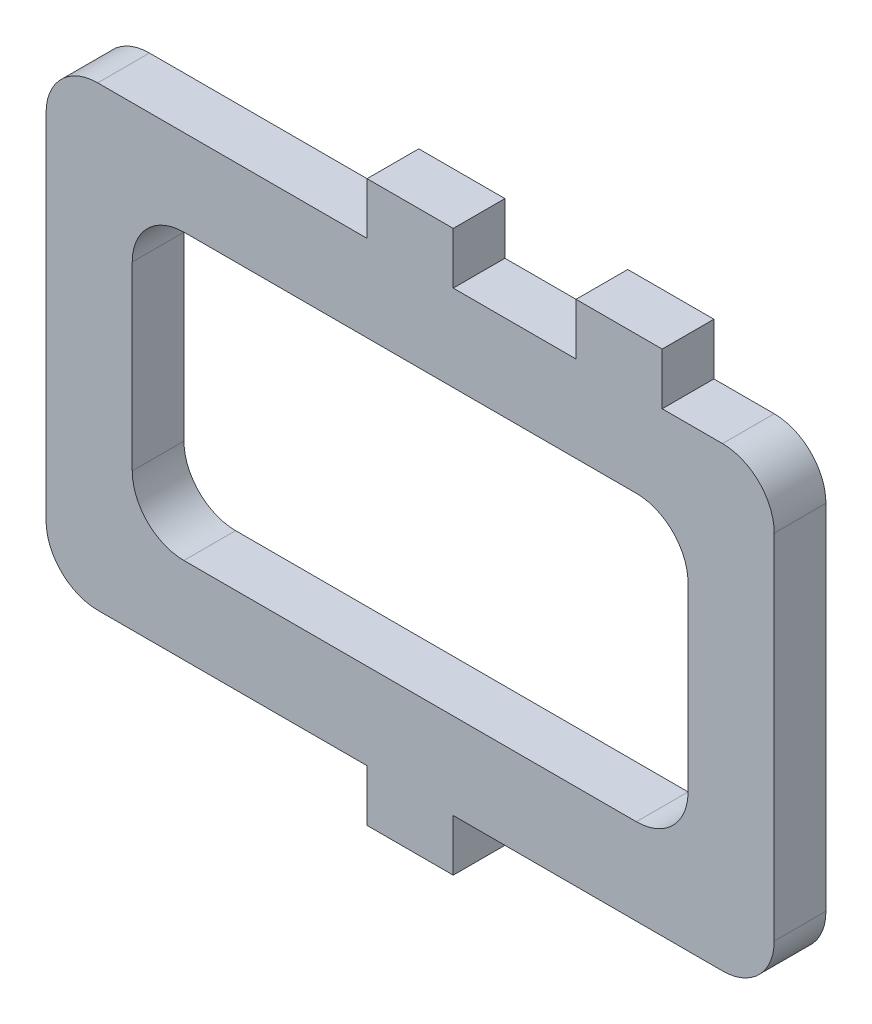
ISO-10303-21;
HEADER;
FILE_DESCRIPTION(('STEP AP214'),'2;1');
FILE_NAME('part.step','',(''),(''),'','','');
FILE_SCHEMA(('AUTOMOTIVE_DESIGN { 1 0 10303 214 1 1 1 1 }'));
ENDSEC;
DATA;
#1=APPLICATION_CONTEXT('core data for automotive mechanical design processes');
#2=APPLICATION_PROTOCOL_DEFINITION('international standard','automotive_design',2000,#1);
#3=PRODUCT_CONTEXT('',#1,'mechanical');
#4=PRODUCT('Part','Part','',(#3));
#5=PRODUCT_RELATED_PRODUCT_CATEGORY('part','',(#4));
#6=PRODUCT_DEFINITION_FORMATION('','',#4);
#7=PRODUCT_DEFINITION_CONTEXT('part definition',#1,'design');
#8=PRODUCT_DEFINITION('design','',#6,#7);
#9=PRODUCT_DEFINITION_SHAPE('','',#8);
#10=(LENGTH_UNIT() NAMED_UNIT(*) SI_UNIT(.MILLI.,.METRE.));
#11=(NAMED_UNIT(*) PLANE_ANGLE_UNIT() SI_UNIT($,.RADIAN.));
#12=(NAMED_UNIT(*) SI_UNIT($,.STERADIAN.) SOLID_ANGLE_UNIT());
#13=UNCERTAINTY_MEASURE_WITH_UNIT(LENGTH_MEASURE(1.E-05),#10,'distance_accuracy_value','');
#14=(GEOMETRIC_REPRESENTATION_CONTEXT(3) GLOBAL_UNCERTAINTY_ASSIGNED_CONTEXT((#13)) GLOBAL_UNIT_ASSIGNED_CONTEXT((#10,
#11,#12)) REPRESENTATION_CONTEXT('',''));
#15=CARTESIAN_POINT('',(0.,0.,0.));
#16=DIRECTION('',(0.,0.,1.));
#17=DIRECTION('',(1.,0.,0.));
#18=AXIS2_PLACEMENT_3D('',#15,#16,#17);
#19=CARTESIAN_POINT('',(-123.240102367902,-87.7219528240552,3.));
#20=DIRECTION('',(0.,0.,-1.));
#21=DIRECTION('',(-1.,0.,0.));
#22=AXIS2_PLACEMENT_3D('',#19,#20,#21);
#23=CYLINDRICAL_SURFACE('',#22,3.);
#24=CARTESIAN_POINT('',(-123.240102367902,-87.7219528240552,0.));
#25=DIRECTION('',(0.,0.,1.));
#26=DIRECTION('',(1.,0.,0.));
#27=AXIS2_PLACEMENT_3D('',#24,#25,#26);
#28=CIRCLE('',#27,3.);
#29=CARTESIAN_POINT('',(-126.240102367902,-87.7219528240552,0.));
#30=VERTEX_POINT('',#29);
#31=CARTESIAN_POINT('',(-123.240102367902,-90.7219528240552,0.));
#32=VERTEX_POINT('',#31);
#33=EDGE_CURVE('E258',#30,#32,#28,.T.);
#34=ORIENTED_EDGE('',*,*,#33,.T.);
#35=DIRECTION('',(0.,0.,-1.));
#36=VECTOR('',#35,1.);
#37=CARTESIAN_POINT('',(-123.240102367902,-90.7219528240552,3.));
#38=LINE('',#37,#36);
#39=CARTESIAN_POINT('',(-123.240102367902,-90.7219528240552,3.));
#40=VERTEX_POINT('',#39);
#41=EDGE_CURVE('E408',#40,#32,#38,.T.);
#42=ORIENTED_EDGE('',*,*,#41,.F.);
#43=CARTESIAN_POINT('',(-123.240102367902,-87.7219528240552,3.));
#44=DIRECTION('',(0.,0.,1.));
#45=DIRECTION('',(1.,0.,0.));
#46=AXIS2_PLACEMENT_3D('',#43,#44,#45);
#47=CIRCLE('',#46,3.);
#48=CARTESIAN_POINT('',(-126.240102367902,-87.7219528240552,3.));
#49=VERTEX_POINT('',#48);
#50=EDGE_CURVE('E269',#49,#40,#47,.T.);
#51=ORIENTED_EDGE('',*,*,#50,.F.);
#52=DIRECTION('',(0.,0.,-1.));
#53=VECTOR('',#52,1.);
#54=CARTESIAN_POINT('',(-126.240102367902,-87.7219528240552,3.));
#55=LINE('',#54,#53);
#56=EDGE_CURVE('E311',#49,#30,#55,.T.);
#57=ORIENTED_EDGE('',*,*,#56,.T.);
#58=EDGE_LOOP('',(#34,#42,#51,#57));
#59=FACE_BOUND('',#58,.T.);
#60=ADVANCED_FACE('F35',(#59),#23,.T.);
#61=CARTESIAN_POINT('',(-107.615102367902,-90.7219528240552,3.));
#62=DIRECTION('',(0.,1.,0.));
#63=DIRECTION('',(0.,0.,1.));
#64=AXIS2_PLACEMENT_3D('',#61,#62,#63);
#65=PLANE('',#64);
#66=DIRECTION('',(1.,0.,0.));
#67=VECTOR('',#66,1.);
#68=CARTESIAN_POINT('',(-107.615102367902,-90.7219528240552,0.));
#69=LINE('',#68,#67);
#70=CARTESIAN_POINT('',(-107.615102367902,-90.7219528240552,0.));
#71=VERTEX_POINT('',#70);
#72=EDGE_CURVE('E314',#32,#71,#69,.T.);
#73=ORIENTED_EDGE('',*,*,#72,.T.);
#74=DIRECTION('',(0.,0.,-1.));
#75=VECTOR('',#74,1.);
#76=CARTESIAN_POINT('',(-107.615102367902,-90.7219528240552,3.));
#77=LINE('',#76,#75);
#78=CARTESIAN_POINT('',(-107.615102367902,-90.7219528240552,3.));
#79=VERTEX_POINT('',#78);
#80=EDGE_CURVE('E405',#79,#71,#77,.T.);
#81=ORIENTED_EDGE('',*,*,#80,.F.);
#82=DIRECTION('',(1.,0.,0.));
#83=VECTOR('',#82,1.);
#84=CARTESIAN_POINT('',(-107.615102367902,-90.7219528240552,3.));
#85=LINE('',#84,#83);
#86=EDGE_CURVE('E272',#40,#79,#85,.T.);
#87=ORIENTED_EDGE('',*,*,#86,.F.);
#88=ORIENTED_EDGE('',*,*,#41,.T.);
#89=EDGE_LOOP('',(#73,#81,#87,#88));
#90=FACE_BOUND('',#89,.T.);
#91=ADVANCED_FACE('F459',(#90),#65,.F.);
#92=CARTESIAN_POINT('',(-107.615102367902,-90.7219528240552,3.));
#93=DIRECTION('',(1.,0.,0.));
#94=DIRECTION('',(0.,0.,-1.));
#95=AXIS2_PLACEMENT_3D('',#92,#93,#94);
#96=PLANE('',#95);
#97=DIRECTION('',(0.,-1.,0.));
#98=VECTOR('',#97,1.);
#99=CARTESIAN_POINT('',(-107.615102367902,-90.7219528240552,0.));
#100=LINE('',#99,#98);
#101=CARTESIAN_POINT('',(-107.615102367902,-93.7219528240552,0.));
#102=VERTEX_POINT('',#101);
#103=EDGE_CURVE('E316',#71,#102,#100,.T.);
#104=ORIENTED_EDGE('',*,*,#103,.T.);
#105=DIRECTION('',(0.,0.,-1.));
#106=VECTOR('',#105,1.);
#107=CARTESIAN_POINT('',(-107.615102367902,-93.7219528240552,3.));
#108=LINE('',#107,#106);
#109=CARTESIAN_POINT('',(-107.615102367902,-93.7219528240552,3.));
#110=VERTEX_POINT('',#109);
#111=EDGE_CURVE('E402',#110,#102,#108,.T.);
#112=ORIENTED_EDGE('',*,*,#111,.F.);
#113=DIRECTION('',(0.,-1.,0.));
#114=VECTOR('',#113,1.);
#115=CARTESIAN_POINT('',(-107.615102367902,-90.7219528240552,3.));
#116=LINE('',#115,#114);
#117=EDGE_CURVE('E275',#79,#110,#116,.T.);
#118=ORIENTED_EDGE('',*,*,#117,.F.);
#119=ORIENTED_EDGE('',*,*,#80,.T.);
#120=EDGE_LOOP('',(#104,#112,#118,#119));
#121=FACE_BOUND('',#120,.T.);
#122=ADVANCED_FACE('F464',(#121),#96,.F.);
#123=CARTESIAN_POINT('',(-107.615102367902,-93.7219528240552,3.));
#124=DIRECTION('',(0.,1.,0.));
#125=DIRECTION('',(0.,0.,1.));
#126=AXIS2_PLACEMENT_3D('',#123,#124,#125);
#127=PLANE('',#126);
#128=DIRECTION('',(1.,0.,0.));
#129=VECTOR('',#128,1.);
#130=CARTESIAN_POINT('',(-107.615102367902,-93.7219528240552,0.));
#131=LINE('',#130,#129);
#132=CARTESIAN_POINT('',(-102.615102367902,-93.7219528240552,0.));
#133=VERTEX_POINT('',#132);
#134=EDGE_CURVE('E318',#102,#133,#131,.T.);
#135=ORIENTED_EDGE('',*,*,#134,.T.);
#136=DIRECTION('',(0.,0.,-1.));
#137=VECTOR('',#136,1.);
#138=CARTESIAN_POINT('',(-102.615102367902,-93.7219528240552,3.));
#139=LINE('',#138,#137);
#140=CARTESIAN_POINT('',(-102.615102367902,-93.7219528240552,3.));
#141=VERTEX_POINT('',#140);
#142=EDGE_CURVE('E399',#141,#133,#139,.T.);
#143=ORIENTED_EDGE('',*,*,#142,.F.);
#144=DIRECTION('',(1.,0.,0.));
#145=VECTOR('',#144,1.);
#146=CARTESIAN_POINT('',(-107.615102367902,-93.7219528240552,3.));
#147=LINE('',#146,#145);
#148=EDGE_CURVE('E277',#110,#141,#147,.T.);
#149=ORIENTED_EDGE('',*,*,#148,.F.);
#150=ORIENTED_EDGE('',*,*,#111,.T.);
#151=EDGE_LOOP('',(#135,#143,#149,#150));
#152=FACE_BOUND('',#151,.T.);
#153=ADVANCED_FACE('F554',(#152),#127,.F.);
#154=CARTESIAN_POINT('',(-102.615102367902,-93.7219528240552,3.));
#155=DIRECTION('',(-1.,0.,0.));
#156=DIRECTION('',(0.,0.,1.));
#157=AXIS2_PLACEMENT_3D('',#154,#155,#156);
#158=PLANE('',#157);
#159=DIRECTION('',(0.,1.,0.));
#160=VECTOR('',#159,1.);
#161=CARTESIAN_POINT('',(-102.615102367902,-93.7219528240552,0.));
#162=LINE('',#161,#160);
#163=CARTESIAN_POINT('',(-102.615102367902,-90.7219528240552,0.));
#164=VERTEX_POINT('',#163);
#165=EDGE_CURVE('E320',#133,#164,#162,.T.);
#166=ORIENTED_EDGE('',*,*,#165,.T.);
#167=DIRECTION('',(0.,0.,-1.));
#168=VECTOR('',#167,1.);
#169=CARTESIAN_POINT('',(-102.615102367902,-90.7219528240552,3.));
#170=LINE('',#169,#168);
#171=CARTESIAN_POINT('',(-102.615102367902,-90.7219528240552,3.));
#172=VERTEX_POINT('',#171);
#173=EDGE_CURVE('E396',#172,#164,#170,.T.);
#174=ORIENTED_EDGE('',*,*,#173,.F.);
#175=DIRECTION('',(0.,1.,0.));
#176=VECTOR('',#175,1.);
#177=CARTESIAN_POINT('',(-102.615102367902,-93.7219528240552,3.));
#178=LINE('',#177,#176);
#179=EDGE_CURVE('E279',#141,#172,#178,.T.);
#180=ORIENTED_EDGE('',*,*,#179,.F.);
#181=ORIENTED_EDGE('',*,*,#142,.T.);
#182=EDGE_LOOP('',(#166,#174,#180,#181));
#183=FACE_BOUND('',#182,.T.);
#184=ADVANCED_FACE('F551',(#183),#158,.F.);
#185=CARTESIAN_POINT('',(-102.615102367902,-90.7219528240552,3.));
#186=DIRECTION('',(0.,1.,0.));
#187=DIRECTION('',(0.,0.,1.));
#188=AXIS2_PLACEMENT_3D('',#185,#186,#187);
#189=PLANE('',#188);
#190=DIRECTION('',(1.,0.,0.));
#191=VECTOR('',#190,1.);
#192=CARTESIAN_POINT('',(-102.615102367902,-90.7219528240552,0.));
#193=LINE('',#192,#191);
#194=CARTESIAN_POINT('',(-86.9901023679022,-90.7219528240552,0.));
#195=VERTEX_POINT('',#194);
#196=EDGE_CURVE('E322',#164,#195,#193,.T.);
#197=ORIENTED_EDGE('',*,*,#196,.T.);
#198=DIRECTION('',(0.,0.,-1.));
#199=VECTOR('',#198,1.);
#200=CARTESIAN_POINT('',(-86.9901023679022,-90.7219528240552,3.));
#201=LINE('',#200,#199);
#202=CARTESIAN_POINT('',(-86.9901023679022,-90.7219528240552,3.));
#203=VERTEX_POINT('',#202);
#204=EDGE_CURVE('E393',#203,#195,#201,.T.);
#205=ORIENTED_EDGE('',*,*,#204,.F.);
#206=DIRECTION('',(1.,0.,0.));
#207=VECTOR('',#206,1.);
#208=CARTESIAN_POINT('',(-102.615102367902,-90.7219528240552,3.));
#209=LINE('',#208,#207);
#210=EDGE_CURVE('E281',#172,#203,#209,.T.);
#211=ORIENTED_EDGE('',*,*,#210,.F.);
#212=ORIENTED_EDGE('',*,*,#173,.T.);
#213=EDGE_LOOP('',(#197,#205,#211,#212));
#214=FACE_BOUND('',#213,.T.);
#215=ADVANCED_FACE('F547',(#214),#189,.F.);
#216=CARTESIAN_POINT('',(-86.9901023679022,-87.7219528240552,3.));
#217=DIRECTION('',(0.,0.,-1.));
#218=DIRECTION('',(-1.,0.,0.));
#219=AXIS2_PLACEMENT_3D('',#216,#217,#218);
#220=CYLINDRICAL_SURFACE('',#219,3.);
#221=CARTESIAN_POINT('',(-86.9901023679022,-87.7219528240552,0.));
#222=DIRECTION('',(0.,0.,1.));
#223=DIRECTION('',(1.,0.,0.));
#224=AXIS2_PLACEMENT_3D('',#221,#222,#223);
#225=CIRCLE('',#224,3.);
#226=CARTESIAN_POINT('',(-83.9901023679022,-87.7219528240552,0.));
#227=VERTEX_POINT('',#226);
#228=EDGE_CURVE('E324',#195,#227,#225,.T.);
#229=ORIENTED_EDGE('',*,*,#228,.T.);
#230=DIRECTION('',(0.,0.,-1.));
#231=VECTOR('',#230,1.);
#232=CARTESIAN_POINT('',(-83.9901023679022,-87.7219528240552,3.));
#233=LINE('',#232,#231);
#234=CARTESIAN_POINT('',(-83.9901023679022,-87.7219528240552,3.));
#235=VERTEX_POINT('',#234);
#236=EDGE_CURVE('E390',#235,#227,#233,.T.);
#237=ORIENTED_EDGE('',*,*,#236,.F.);
#238=CARTESIAN_POINT('',(-86.9901023679022,-87.7219528240552,3.));
#239=DIRECTION('',(0.,0.,1.));
#240=DIRECTION('',(1.,0.,0.));
#241=AXIS2_PLACEMENT_3D('',#238,#239,#240);
#242=CIRCLE('',#241,3.);
#243=EDGE_CURVE('E283',#203,#235,#242,.T.);
#244=ORIENTED_EDGE('',*,*,#243,.F.);
#245=ORIENTED_EDGE('',*,*,#204,.T.);
#246=EDGE_LOOP('',(#229,#237,#244,#245));
#247=FACE_BOUND('',#246,.T.);
#248=ADVANCED_FACE('F542',(#247),#220,.T.);
#249=CARTESIAN_POINT('',(-83.9901023679022,-87.7219528240552,3.));
#250=DIRECTION('',(-1.,0.,0.));
#251=DIRECTION('',(0.,-1.,0.));
#252=AXIS2_PLACEMENT_3D('',#249,#250,#251);
#253=PLANE('',#252);
#254=DIRECTION('',(0.,1.,0.));
#255=VECTOR('',#254,1.);
#256=CARTESIAN_POINT('',(-83.9901023679022,-87.7219528240552,0.));
#257=LINE('',#256,#255);
#258=CARTESIAN_POINT('',(-83.9901023679022,-67.2219528240552,0.));
#259=VERTEX_POINT('',#258);
#260=EDGE_CURVE('E326',#227,#259,#257,.T.);
#261=ORIENTED_EDGE('',*,*,#260,.T.);
#262=DIRECTION('',(0.,0.,-1.));
#263=VECTOR('',#262,1.);
#264=CARTESIAN_POINT('',(-83.9901023679022,-67.2219528240552,3.));
#265=LINE('',#264,#263);
#266=CARTESIAN_POINT('',(-83.9901023679022,-67.2219528240552,3.));
#267=VERTEX_POINT('',#266);
#268=EDGE_CURVE('E387',#267,#259,#265,.T.);
#269=ORIENTED_EDGE('',*,*,#268,.F.);
#270=DIRECTION('',(0.,1.,0.));
#271=VECTOR('',#270,1.);
#272=CARTESIAN_POINT('',(-83.9901023679022,-87.7219528240552,3.));
#273=LINE('',#272,#271);
#274=EDGE_CURVE('E285',#235,#267,#273,.T.);
#275=ORIENTED_EDGE('',*,*,#274,.F.);
#276=ORIENTED_EDGE('',*,*,#236,.T.);
#277=EDGE_LOOP('',(#261,#269,#275,#276));
#278=FACE_BOUND('',#277,.T.);
#279=ADVANCED_FACE('F536',(#278),#253,.F.);
#280=CARTESIAN_POINT('',(-86.9901023679022,-67.2219528240552,3.));
#281=DIRECTION('',(0.,0.,-1.));
#282=DIRECTION('',(-1.,0.,0.));
#283=AXIS2_PLACEMENT_3D('',#280,#281,#282);
#284=CYLINDRICAL_SURFACE('',#283,3.);
#285=CARTESIAN_POINT('',(-86.9901023679022,-67.2219528240552,0.));
#286=DIRECTION('',(0.,0.,1.));
#287=DIRECTION('',(1.,0.,0.));
#288=AXIS2_PLACEMENT_3D('',#285,#286,#287);
#289=CIRCLE('',#288,3.);
#290=CARTESIAN_POINT('',(-86.9901023679022,-64.2219528240552,0.));
#291=VERTEX_POINT('',#290);
#292=EDGE_CURVE('E328',#259,#291,#289,.T.);
#293=ORIENTED_EDGE('',*,*,#292,.T.);
#294=DIRECTION('',(0.,0.,-1.));
#295=VECTOR('',#294,1.);
#296=CARTESIAN_POINT('',(-86.9901023679022,-64.2219528240552,3.));
#297=LINE('',#296,#295);
#298=CARTESIAN_POINT('',(-86.9901023679022,-64.2219528240552,3.));
#299=VERTEX_POINT('',#298);
#300=EDGE_CURVE('E384',#299,#291,#297,.T.);
#301=ORIENTED_EDGE('',*,*,#300,.F.);
#302=CARTESIAN_POINT('',(-86.9901023679022,-67.2219528240552,3.));
#303=DIRECTION('',(0.,0.,1.));
#304=DIRECTION('',(1.,0.,0.));
#305=AXIS2_PLACEMENT_3D('',#302,#303,#304);
#306=CIRCLE('',#305,3.);
#307=EDGE_CURVE('E287',#267,#299,#306,.T.);
#308=ORIENTED_EDGE('',*,*,#307,.F.);
#309=ORIENTED_EDGE('',*,*,#268,.T.);
#310=EDGE_LOOP('',(#293,#301,#308,#309));
#311=FACE_BOUND('',#310,.T.);
#312=ADVANCED_FACE('F532',(#311),#284,.T.);
#313=CARTESIAN_POINT('',(-90.4901023679022,-64.2219528240552,3.));
#314=DIRECTION('',(0.,-1.,0.));
#315=DIRECTION('',(0.,0.,-1.));
#316=AXIS2_PLACEMENT_3D('',#313,#314,#315);
#317=PLANE('',#316);
#318=DIRECTION('',(-1.,0.,0.));
#319=VECTOR('',#318,1.);
#320=CARTESIAN_POINT('',(-90.4901023679022,-64.2219528240552,0.));
#321=LINE('',#320,#319);
#322=CARTESIAN_POINT('',(-90.4901023679022,-64.2219528240552,0.));
#323=VERTEX_POINT('',#322);
#324=EDGE_CURVE('E330',#291,#323,#321,.T.);
#325=ORIENTED_EDGE('',*,*,#324,.T.);
#326=DIRECTION('',(0.,0.,-1.));
#327=VECTOR('',#326,1.);
#328=CARTESIAN_POINT('',(-90.4901023679022,-64.2219528240552,3.));
#329=LINE('',#328,#327);
#330=CARTESIAN_POINT('',(-90.4901023679022,-64.2219528240552,3.));
#331=VERTEX_POINT('',#330);
#332=EDGE_CURVE('E381',#331,#323,#329,.T.);
#333=ORIENTED_EDGE('',*,*,#332,.F.);
#334=DIRECTION('',(-1.,0.,0.));
#335=VECTOR('',#334,1.);
#336=CARTESIAN_POINT('',(-90.4901023679022,-64.2219528240552,3.));
#337=LINE('',#336,#335);
#338=EDGE_CURVE('E289',#299,#331,#337,.T.);
#339=ORIENTED_EDGE('',*,*,#338,.F.);
#340=ORIENTED_EDGE('',*,*,#300,.T.);
#341=EDGE_LOOP('',(#325,#333,#339,#340));
#342=FACE_BOUND('',#341,.T.);
#343=ADVANCED_FACE('F527',(#342),#317,.F.);
#344=CARTESIAN_POINT('',(-90.4901023679022,-61.2219528240552,3.));
#345=DIRECTION('',(-1.,0.,0.));
#346=DIRECTION('',(0.,0.,1.));
#347=AXIS2_PLACEMENT_3D('',#344,#345,#346);
#348=PLANE('',#347);
#349=DIRECTION('',(0.,1.,0.));
#350=VECTOR('',#349,1.);
#351=CARTESIAN_POINT('',(-90.4901023679022,-61.2219528240552,0.));
#352=LINE('',#351,#350);
#353=CARTESIAN_POINT('',(-90.4901023679022,-61.2219528240552,0.));
#354=VERTEX_POINT('',#353);
#355=EDGE_CURVE('E332',#323,#354,#352,.T.);
#356=ORIENTED_EDGE('',*,*,#355,.T.);
#357=DIRECTION('',(0.,0.,-1.));
#358=VECTOR('',#357,1.);
#359=CARTESIAN_POINT('',(-90.4901023679022,-61.2219528240552,3.));
#360=LINE('',#359,#358);
#361=CARTESIAN_POINT('',(-90.4901023679022,-61.2219528240552,3.));
#362=VERTEX_POINT('',#361);
#363=EDGE_CURVE('E378',#362,#354,#360,.T.);
#364=ORIENTED_EDGE('',*,*,#363,.F.);
#365=DIRECTION('',(0.,1.,0.));
#366=VECTOR('',#365,1.);
#367=CARTESIAN_POINT('',(-90.4901023679022,-61.2219528240552,3.));
#368=LINE('',#367,#366);
#369=EDGE_CURVE('E291',#331,#362,#368,.T.);
#370=ORIENTED_EDGE('',*,*,#369,.F.);
#371=ORIENTED_EDGE('',*,*,#332,.T.);
#372=EDGE_LOOP('',(#356,#364,#370,#371));
#373=FACE_BOUND('',#372,.T.);
#374=ADVANCED_FACE('F521',(#373),#348,.F.);
#375=CARTESIAN_POINT('',(-95.4901023679022,-61.2219528240552,3.));
#376=DIRECTION('',(0.,-1.,0.));
#377=DIRECTION('',(0.,0.,-1.));
#378=AXIS2_PLACEMENT_3D('',#375,#376,#377);
#379=PLANE('',#378);
#380=DIRECTION('',(-1.,0.,0.));
#381=VECTOR('',#380,1.);
#382=CARTESIAN_POINT('',(-95.4901023679022,-61.2219528240552,0.));
#383=LINE('',#382,#381);
#384=CARTESIAN_POINT('',(-95.4901023679022,-61.2219528240552,0.));
#385=VERTEX_POINT('',#384);
#386=EDGE_CURVE('E334',#354,#385,#383,.T.);
#387=ORIENTED_EDGE('',*,*,#386,.T.);
#388=DIRECTION('',(0.,0.,-1.));
#389=VECTOR('',#388,1.);
#390=CARTESIAN_POINT('',(-95.4901023679022,-61.2219528240552,3.));
#391=LINE('',#390,#389);
#392=CARTESIAN_POINT('',(-95.4901023679022,-61.2219528240552,3.));
#393=VERTEX_POINT('',#392);
#394=EDGE_CURVE('E375',#393,#385,#391,.T.);
#395=ORIENTED_EDGE('',*,*,#394,.F.);
#396=DIRECTION('',(-1.,0.,0.));
#397=VECTOR('',#396,1.);
#398=CARTESIAN_POINT('',(-95.4901023679022,-61.2219528240552,3.));
#399=LINE('',#398,#397);
#400=EDGE_CURVE('E293',#362,#393,#399,.T.);
#401=ORIENTED_EDGE('',*,*,#400,.F.);
#402=ORIENTED_EDGE('',*,*,#363,.T.);
#403=EDGE_LOOP('',(#387,#395,#401,#402));
#404=FACE_BOUND('',#403,.T.);
#405=ADVANCED_FACE('F517',(#404),#379,.F.);
#406=CARTESIAN_POINT('',(-95.4901023679022,-61.2219528240552,3.));
#407=DIRECTION('',(1.,0.,0.));
#408=DIRECTION('',(0.,0.,-1.));
#409=AXIS2_PLACEMENT_3D('',#406,#407,#408);
#410=PLANE('',#409);
#411=DIRECTION('',(0.,-1.,0.));
#412=VECTOR('',#411,1.);
#413=CARTESIAN_POINT('',(-95.4901023679022,-61.2219528240552,0.));
#414=LINE('',#413,#412);
#415=CARTESIAN_POINT('',(-95.4901023679022,-64.2219528240552,0.));
#416=VERTEX_POINT('',#415);
#417=EDGE_CURVE('E336',#385,#416,#414,.T.);
#418=ORIENTED_EDGE('',*,*,#417,.T.);
#419=DIRECTION('',(0.,0.,-1.));
#420=VECTOR('',#419,1.);
#421=CARTESIAN_POINT('',(-95.4901023679022,-64.2219528240552,3.));
#422=LINE('',#421,#420);
#423=CARTESIAN_POINT('',(-95.4901023679022,-64.2219528240552,3.));
#424=VERTEX_POINT('',#423);
#425=EDGE_CURVE('E372',#424,#416,#422,.T.);
#426=ORIENTED_EDGE('',*,*,#425,.F.);
#427=DIRECTION('',(0.,-1.,0.));
#428=VECTOR('',#427,1.);
#429=CARTESIAN_POINT('',(-95.4901023679022,-61.2219528240552,3.));
#430=LINE('',#429,#428);
#431=EDGE_CURVE('E295',#393,#424,#430,.T.);
#432=ORIENTED_EDGE('',*,*,#431,.F.);
#433=ORIENTED_EDGE('',*,*,#394,.T.);
#434=EDGE_LOOP('',(#418,#426,#432,#433));
#435=FACE_BOUND('',#434,.T.);
#436=ADVANCED_FACE('F512',(#435),#410,.F.);
#437=CARTESIAN_POINT('',(-95.4901023679022,-64.2219528240552,3.));
#438=DIRECTION('',(0.,-1.,0.));
#439=DIRECTION('',(0.,0.,-1.));
#440=AXIS2_PLACEMENT_3D('',#437,#438,#439);
#441=PLANE('',#440);
#442=DIRECTION('',(-1.,0.,0.));
#443=VECTOR('',#442,1.);
#444=CARTESIAN_POINT('',(-95.4901023679022,-64.2219528240552,0.));
#445=LINE('',#444,#443);
#446=CARTESIAN_POINT('',(-102.615102367902,-64.2219528240552,0.));
#447=VERTEX_POINT('',#446);
#448=EDGE_CURVE('E338',#416,#447,#445,.T.);
#449=ORIENTED_EDGE('',*,*,#448,.T.);
#450=DIRECTION('',(0.,0.,-1.));
#451=VECTOR('',#450,1.);
#452=CARTESIAN_POINT('',(-102.615102367902,-64.2219528240552,3.));
#453=LINE('',#452,#451);
#454=CARTESIAN_POINT('',(-102.615102367902,-64.2219528240552,3.));
#455=VERTEX_POINT('',#454);
#456=EDGE_CURVE('E369',#455,#447,#453,.T.);
#457=ORIENTED_EDGE('',*,*,#456,.F.);
#458=DIRECTION('',(-1.,0.,0.));
#459=VECTOR('',#458,1.);
#460=CARTESIAN_POINT('',(-95.4901023679022,-64.2219528240552,3.));
#461=LINE('',#460,#459);
#462=EDGE_CURVE('E297',#424,#455,#461,.T.);
#463=ORIENTED_EDGE('',*,*,#462,.F.);
#464=ORIENTED_EDGE('',*,*,#425,.T.);
#465=EDGE_LOOP('',(#449,#457,#463,#464));
#466=FACE_BOUND('',#465,.T.);
#467=ADVANCED_FACE('F506',(#466),#441,.F.);
#468=CARTESIAN_POINT('',(-102.615102367902,-61.2219528240552,3.));
#469=DIRECTION('',(-1.,0.,0.));
#470=DIRECTION('',(0.,0.,1.));
#471=AXIS2_PLACEMENT_3D('',#468,#469,#470);
#472=PLANE('',#471);
#473=DIRECTION('',(0.,1.,0.));
#474=VECTOR('',#473,1.);
#475=CARTESIAN_POINT('',(-102.615102367902,-61.2219528240552,0.));
#476=LINE('',#475,#474);
#477=CARTESIAN_POINT('',(-102.615102367902,-61.2219528240552,0.));
#478=VERTEX_POINT('',#477);
#479=EDGE_CURVE('E340',#447,#478,#476,.T.);
#480=ORIENTED_EDGE('',*,*,#479,.T.);
#481=DIRECTION('',(0.,0.,-1.));
#482=VECTOR('',#481,1.);
#483=CARTESIAN_POINT('',(-102.615102367902,-61.2219528240552,3.));
#484=LINE('',#483,#482);
#485=CARTESIAN_POINT('',(-102.615102367902,-61.2219528240552,3.));
#486=VERTEX_POINT('',#485);
#487=EDGE_CURVE('E366',#486,#478,#484,.T.);
#488=ORIENTED_EDGE('',*,*,#487,.F.);
#489=DIRECTION('',(0.,1.,0.));
#490=VECTOR('',#489,1.);
#491=CARTESIAN_POINT('',(-102.615102367902,-61.2219528240552,3.));
#492=LINE('',#491,#490);
#493=EDGE_CURVE('E299',#455,#486,#492,.T.);
#494=ORIENTED_EDGE('',*,*,#493,.F.);
#495=ORIENTED_EDGE('',*,*,#456,.T.);
#496=EDGE_LOOP('',(#480,#488,#494,#495));
#497=FACE_BOUND('',#496,.T.);
#498=ADVANCED_FACE('F501',(#497),#472,.F.);
#499=CARTESIAN_POINT('',(-107.615102367902,-61.2219528240552,3.));
#500=DIRECTION('',(0.,-1.,0.));
#501=DIRECTION('',(0.,0.,-1.));
#502=AXIS2_PLACEMENT_3D('',#499,#500,#501);
#503=PLANE('',#502);
#504=DIRECTION('',(-1.,0.,0.));
#505=VECTOR('',#504,1.);
#506=CARTESIAN_POINT('',(-107.615102367902,-61.2219528240552,0.));
#507=LINE('',#506,#505);
#508=CARTESIAN_POINT('',(-107.615102367902,-61.2219528240552,0.));
#509=VERTEX_POINT('',#508);
#510=EDGE_CURVE('E343',#478,#509,#507,.T.);
#511=ORIENTED_EDGE('',*,*,#510,.T.);
#512=DIRECTION('',(0.,0.,-1.));
#513=VECTOR('',#512,1.);
#514=CARTESIAN_POINT('',(-107.615102367902,-61.2219528240552,3.));
#515=LINE('',#514,#513);
#516=CARTESIAN_POINT('',(-107.615102367902,-61.2219528240552,3.));
#517=VERTEX_POINT('',#516);
#518=EDGE_CURVE('E363',#517,#509,#515,.T.);
#519=ORIENTED_EDGE('',*,*,#518,.F.);
#520=DIRECTION('',(-1.,0.,0.));
#521=VECTOR('',#520,1.);
#522=CARTESIAN_POINT('',(-105.115102367902,-61.2219528240552,3.));
#523=LINE('',#522,#521);
#524=EDGE_CURVE('E301',#486,#517,#523,.T.);
#525=ORIENTED_EDGE('',*,*,#524,.F.);
#526=ORIENTED_EDGE('',*,*,#487,.T.);
#527=EDGE_LOOP('',(#511,#519,#525,#526));
#528=FACE_BOUND('',#527,.T.);
#529=ADVANCED_FACE('F496',(#528),#503,.F.);
#530=CARTESIAN_POINT('',(-107.615102367902,-61.2219528240552,3.));
#531=DIRECTION('',(1.,0.,0.));
#532=DIRECTION('',(0.,0.,-1.));
#533=AXIS2_PLACEMENT_3D('',#530,#531,#532);
#534=PLANE('',#533);
#535=DIRECTION('',(0.,-1.,0.));
#536=VECTOR('',#535,1.);
#537=CARTESIAN_POINT('',(-107.615102367902,-61.2219528240552,0.));
#538=LINE('',#537,#536);
#539=CARTESIAN_POINT('',(-107.615102367902,-64.2219528240552,0.));
#540=VERTEX_POINT('',#539);
#541=EDGE_CURVE('E345',#509,#540,#538,.T.);
#542=ORIENTED_EDGE('',*,*,#541,.T.);
#543=DIRECTION('',(0.,0.,-1.));
#544=VECTOR('',#543,1.);
#545=CARTESIAN_POINT('',(-107.615102367902,-64.2219528240552,3.));
#546=LINE('',#545,#544);
#547=CARTESIAN_POINT('',(-107.615102367902,-64.2219528240552,3.));
#548=VERTEX_POINT('',#547);
#549=EDGE_CURVE('E360',#548,#540,#546,.T.);
#550=ORIENTED_EDGE('',*,*,#549,.F.);
#551=DIRECTION('',(0.,-1.,0.));
#552=VECTOR('',#551,1.);
#553=CARTESIAN_POINT('',(-107.615102367902,-61.2219528240552,3.));
#554=LINE('',#553,#552);
#555=EDGE_CURVE('E303',#517,#548,#554,.T.);
#556=ORIENTED_EDGE('',*,*,#555,.F.);
#557=ORIENTED_EDGE('',*,*,#518,.T.);
#558=EDGE_LOOP('',(#542,#550,#556,#557));
#559=FACE_BOUND('',#558,.T.);
#560=ADVANCED_FACE('F492',(#559),#534,.F.);
#561=CARTESIAN_POINT('',(-123.240102367902,-64.2219528240552,3.));
#562=DIRECTION('',(0.,-1.,0.));
#563=DIRECTION('',(0.,0.,-1.));
#564=AXIS2_PLACEMENT_3D('',#561,#562,#563);
#565=PLANE('',#564);
#566=DIRECTION('',(-1.,0.,0.));
#567=VECTOR('',#566,1.);
#568=CARTESIAN_POINT('',(-123.240102367902,-64.2219528240552,0.));
#569=LINE('',#568,#567);
#570=CARTESIAN_POINT('',(-123.240102367902,-64.2219528240552,0.));
#571=VERTEX_POINT('',#570);
#572=EDGE_CURVE('E347',#540,#571,#569,.T.);
#573=ORIENTED_EDGE('',*,*,#572,.T.);
#574=DIRECTION('',(0.,0.,-1.));
#575=VECTOR('',#574,1.);
#576=CARTESIAN_POINT('',(-123.240102367902,-64.2219528240552,3.));
#577=LINE('',#576,#575);
#578=CARTESIAN_POINT('',(-123.240102367902,-64.2219528240552,3.));
#579=VERTEX_POINT('',#578);
#580=EDGE_CURVE('E357',#579,#571,#577,.T.);
#581=ORIENTED_EDGE('',*,*,#580,.F.);
#582=DIRECTION('',(-1.,0.,0.));
#583=VECTOR('',#582,1.);
#584=CARTESIAN_POINT('',(-123.240102367902,-64.2219528240552,3.));
#585=LINE('',#584,#583);
#586=EDGE_CURVE('E305',#548,#579,#585,.T.);
#587=ORIENTED_EDGE('',*,*,#586,.F.);
#588=ORIENTED_EDGE('',*,*,#549,.T.);
#589=EDGE_LOOP('',(#573,#581,#587,#588));
#590=FACE_BOUND('',#589,.T.);
#591=ADVANCED_FACE('F487',(#590),#565,.F.);
#592=CARTESIAN_POINT('',(-123.240102367902,-67.2219528240552,3.));
#593=DIRECTION('',(0.,0.,-1.));
#594=DIRECTION('',(-1.,0.,0.));
#595=AXIS2_PLACEMENT_3D('',#592,#593,#594);
#596=CYLINDRICAL_SURFACE('',#595,3.);
#597=CARTESIAN_POINT('',(-123.240102367902,-67.2219528240552,0.));
#598=DIRECTION('',(0.,0.,1.));
#599=DIRECTION('',(-1.,0.,0.));
#600=AXIS2_PLACEMENT_3D('',#597,#598,#599);
#601=CIRCLE('',#600,3.);
#602=CARTESIAN_POINT('',(-126.240102367902,-67.2219528240552,0.));
#603=VERTEX_POINT('',#602);
#604=EDGE_CURVE('E349',#571,#603,#601,.T.);
#605=ORIENTED_EDGE('',*,*,#604,.T.);
#606=DIRECTION('',(0.,0.,-1.));
#607=VECTOR('',#606,1.);
#608=CARTESIAN_POINT('',(-126.240102367902,-67.2219528240552,3.));
#609=LINE('',#608,#607);
#610=CARTESIAN_POINT('',(-126.240102367902,-67.2219528240552,3.));
#611=VERTEX_POINT('',#610);
#612=EDGE_CURVE('E354',#611,#603,#609,.T.);
#613=ORIENTED_EDGE('',*,*,#612,.F.);
#614=CARTESIAN_POINT('',(-123.240102367902,-67.2219528240552,3.));
#615=DIRECTION('',(0.,0.,1.));
#616=DIRECTION('',(-1.,0.,0.));
#617=AXIS2_PLACEMENT_3D('',#614,#615,#616);
#618=CIRCLE('',#617,3.);
#619=EDGE_CURVE('E307',#579,#611,#618,.T.);
#620=ORIENTED_EDGE('',*,*,#619,.F.);
#621=ORIENTED_EDGE('',*,*,#580,.T.);
#622=EDGE_LOOP('',(#605,#613,#620,#621));
#623=FACE_BOUND('',#622,.T.);
#624=ADVANCED_FACE('F482',(#623),#596,.T.);
#625=CARTESIAN_POINT('',(-126.240102367902,-87.7219528240552,3.));
#626=DIRECTION('',(1.,0.,0.));
#627=DIRECTION('',(0.,0.,-1.));
#628=AXIS2_PLACEMENT_3D('',#625,#626,#627);
#629=PLANE('',#628);
#630=DIRECTION('',(0.,-1.,0.));
#631=VECTOR('',#630,1.);
#632=CARTESIAN_POINT('',(-126.240102367902,-87.7219528240552,0.));
#633=LINE('',#632,#631);
#634=EDGE_CURVE('E273',#603,#30,#633,.T.);
#635=ORIENTED_EDGE('',*,*,#634,.T.);
#636=ORIENTED_EDGE('',*,*,#56,.F.);
#637=DIRECTION('',(0.,-1.,0.));
#638=VECTOR('',#637,1.);
#639=CARTESIAN_POINT('',(-126.240102367902,-87.7219528240552,3.));
#640=LINE('',#639,#638);
#641=EDGE_CURVE('E309',#611,#49,#640,.T.);
#642=ORIENTED_EDGE('',*,*,#641,.F.);
#643=ORIENTED_EDGE('',*,*,#612,.T.);
#644=EDGE_LOOP('',(#635,#636,#642,#643));
#645=FACE_BOUND('',#644,.T.);
#646=ADVANCED_FACE('F480',(#645),#629,.F.);
#647=CARTESIAN_POINT('',(-123.240102367902,-87.7219528240552,3.));
#648=DIRECTION('',(0.,0.,1.));
#649=DIRECTION('',(1.,0.,0.));
#650=AXIS2_PLACEMENT_3D('',#647,#648,#649);
#651=PLANE('',#650);
#652=CARTESIAN_POINT('',(-118.240102367902,-82.7219528240552,3.));
#653=DIRECTION('',(0.,0.,1.));
#654=DIRECTION('',(-1.,0.,0.));
#655=AXIS2_PLACEMENT_3D('',#652,#653,#654);
#656=CIRCLE('',#655,3.);
#657=CARTESIAN_POINT('',(-121.240102367902,-82.7219528240552,3.));
#658=VERTEX_POINT('',#657);
#659=CARTESIAN_POINT('',(-118.240102367902,-85.7219528240552,3.));
#660=VERTEX_POINT('',#659);
#661=EDGE_CURVE('E49',#658,#660,#656,.T.);
#662=ORIENTED_EDGE('',*,*,#661,.F.);
#663=DIRECTION('',(0.,-1.,0.));
#664=VECTOR('',#663,1.);
#665=CARTESIAN_POINT('',(-121.240102367902,-82.7219528240552,3.));
#666=LINE('',#665,#664);
#667=CARTESIAN_POINT('',(-121.240102367902,-72.2219528240552,3.));
#668=VERTEX_POINT('',#667);
#669=EDGE_CURVE('E253',#668,#658,#666,.T.);
#670=ORIENTED_EDGE('',*,*,#669,.F.);
#671=CARTESIAN_POINT('',(-118.240102367902,-72.2219528240552,3.));
#672=DIRECTION('',(0.,0.,1.));
#673=DIRECTION('',(-1.,0.,0.));
#674=AXIS2_PLACEMENT_3D('',#671,#672,#673);
#675=CIRCLE('',#674,3.);
#676=CARTESIAN_POINT('',(-118.240102367902,-69.2219528240552,3.));
#677=VERTEX_POINT('',#676);
#678=EDGE_CURVE('E250',#677,#668,#675,.T.);
#679=ORIENTED_EDGE('',*,*,#678,.F.);
#680=DIRECTION('',(-1.,0.,0.));
#681=VECTOR('',#680,1.);
#682=CARTESIAN_POINT('',(-118.240102367902,-69.2219528240552,3.));
#683=LINE('',#682,#681);
#684=CARTESIAN_POINT('',(-91.9901023679022,-69.2219528240552,3.));
#685=VERTEX_POINT('',#684);
#686=EDGE_CURVE('E247',#685,#677,#683,.T.);
#687=ORIENTED_EDGE('',*,*,#686,.F.);
#688=CARTESIAN_POINT('',(-91.9901023679022,-72.2219528240552,3.));
#689=DIRECTION('',(0.,0.,1.));
#690=DIRECTION('',(-1.,0.,0.));
#691=AXIS2_PLACEMENT_3D('',#688,#689,#690);
#692=CIRCLE('',#691,3.);
#693=CARTESIAN_POINT('',(-88.9901023679022,-72.2219528240552,3.));
#694=VERTEX_POINT('',#693);
#695=EDGE_CURVE('E241',#694,#685,#692,.T.);
#696=ORIENTED_EDGE('',*,*,#695,.F.);
#697=DIRECTION('',(0.,1.,0.));
#698=VECTOR('',#697,1.);
#699=CARTESIAN_POINT('',(-88.9901023679022,-72.2219528240552,3.));
#700=LINE('',#699,#698);
#701=CARTESIAN_POINT('',(-88.9901023679022,-82.7219528240552,3.));
#702=VERTEX_POINT('',#701);
#703=EDGE_CURVE('E239',#702,#694,#700,.T.);
#704=ORIENTED_EDGE('',*,*,#703,.F.);
#705=CARTESIAN_POINT('',(-91.9901023679022,-82.7219528240552,3.));
#706=DIRECTION('',(0.,0.,1.));
#707=DIRECTION('',(-1.,0.,0.));
#708=AXIS2_PLACEMENT_3D('',#705,#706,#707);
#709=CIRCLE('',#708,3.);
#710=CARTESIAN_POINT('',(-91.9901023679022,-85.7219528240552,3.));
#711=VERTEX_POINT('',#710);
#712=EDGE_CURVE('E222',#711,#702,#709,.T.);
#713=ORIENTED_EDGE('',*,*,#712,.F.);
#714=DIRECTION('',(1.,0.,0.));
#715=VECTOR('',#714,1.);
#716=CARTESIAN_POINT('',(-91.9901023679022,-85.7219528240552,3.));
#717=LINE('',#716,#715);
#718=EDGE_CURVE('E231',#660,#711,#717,.T.);
#719=ORIENTED_EDGE('',*,*,#718,.F.);
#720=EDGE_LOOP('',(#662,#670,#679,#687,#696,#704,#713,#719));
#721=FACE_BOUND('',#720,.T.);
#722=ORIENTED_EDGE('',*,*,#50,.T.);
#723=ORIENTED_EDGE('',*,*,#86,.T.);
#724=ORIENTED_EDGE('',*,*,#117,.T.);
#725=ORIENTED_EDGE('',*,*,#148,.T.);
#726=ORIENTED_EDGE('',*,*,#179,.T.);
#727=ORIENTED_EDGE('',*,*,#210,.T.);
#728=ORIENTED_EDGE('',*,*,#243,.T.);
#729=ORIENTED_EDGE('',*,*,#274,.T.);
#730=ORIENTED_EDGE('',*,*,#307,.T.);
#731=ORIENTED_EDGE('',*,*,#338,.T.);
#732=ORIENTED_EDGE('',*,*,#369,.T.);
#733=ORIENTED_EDGE('',*,*,#400,.T.);
#734=ORIENTED_EDGE('',*,*,#431,.T.);
#735=ORIENTED_EDGE('',*,*,#462,.T.);
#736=ORIENTED_EDGE('',*,*,#493,.T.);
#737=ORIENTED_EDGE('',*,*,#524,.T.);
#738=ORIENTED_EDGE('',*,*,#555,.T.);
#739=ORIENTED_EDGE('',*,*,#586,.T.);
#740=ORIENTED_EDGE('',*,*,#619,.T.);
#741=ORIENTED_EDGE('',*,*,#641,.T.);
#742=EDGE_LOOP('',(#722,#723,#724,#725,#726,#727,#728,#729,#730,#731,#732,#733,#734,#735,#736,
#737,#738,#739,#740,#741));
#743=FACE_BOUND('',#742,.T.);
#744=ADVANCED_FACE('F235',(#721,#743),#651,.T.);
#745=CARTESIAN_POINT('',(-123.240102367902,-87.7219528240552,0.));
#746=DIRECTION('',(0.,0.,1.));
#747=DIRECTION('',(1.,0.,0.));
#748=AXIS2_PLACEMENT_3D('',#745,#746,#747);
#749=PLANE('',#748);
#750=DIRECTION('',(0.,-1.,0.));
#751=VECTOR('',#750,1.);
#752=CARTESIAN_POINT('',(-121.240102367902,-87.7219528240552,0.));
#753=LINE('',#752,#751);
#754=CARTESIAN_POINT('',(-121.240102367902,-72.2219528240552,0.));
#755=VERTEX_POINT('',#754);
#756=CARTESIAN_POINT('',(-121.240102367902,-82.7219528240552,0.));
#757=VERTEX_POINT('',#756);
#758=EDGE_CURVE('E42',#755,#757,#753,.T.);
#759=ORIENTED_EDGE('',*,*,#758,.T.);
#760=CARTESIAN_POINT('',(-118.240102367902,-82.7219528240552,0.));
#761=DIRECTION('',(0.,0.,1.));
#762=DIRECTION('',(1.,0.,0.));
#763=AXIS2_PLACEMENT_3D('',#760,#761,#762);
#764=CIRCLE('',#763,3.);
#765=CARTESIAN_POINT('',(-118.240102367902,-85.7219528240552,0.));
#766=VERTEX_POINT('',#765);
#767=EDGE_CURVE('E11',#757,#766,#764,.T.);
#768=ORIENTED_EDGE('',*,*,#767,.T.);
#769=DIRECTION('',(1.,0.,0.));
#770=VECTOR('',#769,1.);
#771=CARTESIAN_POINT('',(-123.240102367902,-85.7219528240552,0.));
#772=LINE('',#771,#770);
#773=CARTESIAN_POINT('',(-91.9901023679022,-85.7219528240552,0.));
#774=VERTEX_POINT('',#773);
#775=EDGE_CURVE('E411',#766,#774,#772,.T.);
#776=ORIENTED_EDGE('',*,*,#775,.T.);
#777=CARTESIAN_POINT('',(-91.9901023679022,-82.7219528240552,0.));
#778=DIRECTION('',(0.,0.,1.));
#779=DIRECTION('',(1.,0.,0.));
#780=AXIS2_PLACEMENT_3D('',#777,#778,#779);
#781=CIRCLE('',#780,3.);
#782=CARTESIAN_POINT('',(-88.9901023679022,-82.7219528240552,0.));
#783=VERTEX_POINT('',#782);
#784=EDGE_CURVE('E225',#774,#783,#781,.T.);
#785=ORIENTED_EDGE('',*,*,#784,.T.);
#786=DIRECTION('',(0.,1.,0.));
#787=VECTOR('',#786,1.);
#788=CARTESIAN_POINT('',(-88.9901023679022,-87.7219528240552,0.));
#789=LINE('',#788,#787);
#790=CARTESIAN_POINT('',(-88.9901023679022,-72.2219528240552,0.));
#791=VERTEX_POINT('',#790);
#792=EDGE_CURVE('E414',#783,#791,#789,.T.);
#793=ORIENTED_EDGE('',*,*,#792,.T.);
#794=CARTESIAN_POINT('',(-91.9901023679022,-72.2219528240552,0.));
#795=DIRECTION('',(0.,0.,1.));
#796=DIRECTION('',(1.,0.,0.));
#797=AXIS2_PLACEMENT_3D('',#794,#795,#796);
#798=CIRCLE('',#797,3.);
#799=CARTESIAN_POINT('',(-91.9901023679022,-69.2219528240552,0.));
#800=VERTEX_POINT('',#799);
#801=EDGE_CURVE('E417',#791,#800,#798,.T.);
#802=ORIENTED_EDGE('',*,*,#801,.T.);
#803=DIRECTION('',(-1.,0.,0.));
#804=VECTOR('',#803,1.);
#805=CARTESIAN_POINT('',(-123.240102367902,-69.2219528240552,0.));
#806=LINE('',#805,#804);
#807=CARTESIAN_POINT('',(-118.240102367902,-69.2219528240552,0.));
#808=VERTEX_POINT('',#807);
#809=EDGE_CURVE('E420',#800,#808,#806,.T.);
#810=ORIENTED_EDGE('',*,*,#809,.T.);
#811=CARTESIAN_POINT('',(-118.240102367902,-72.2219528240552,0.));
#812=DIRECTION('',(0.,0.,1.));
#813=DIRECTION('',(1.,0.,0.));
#814=AXIS2_PLACEMENT_3D('',#811,#812,#813);
#815=CIRCLE('',#814,3.);
#816=EDGE_CURVE('E423',#808,#755,#815,.T.);
#817=ORIENTED_EDGE('',*,*,#816,.T.);
#818=EDGE_LOOP('',(#759,#768,#776,#785,#793,#802,#810,#817));
#819=FACE_BOUND('',#818,.T.);
#820=ORIENTED_EDGE('',*,*,#33,.F.);
#821=ORIENTED_EDGE('',*,*,#634,.F.);
#822=ORIENTED_EDGE('',*,*,#604,.F.);
#823=ORIENTED_EDGE('',*,*,#572,.F.);
#824=ORIENTED_EDGE('',*,*,#541,.F.);
#825=ORIENTED_EDGE('',*,*,#510,.F.);
#826=ORIENTED_EDGE('',*,*,#479,.F.);
#827=ORIENTED_EDGE('',*,*,#448,.F.);
#828=ORIENTED_EDGE('',*,*,#417,.F.);
#829=ORIENTED_EDGE('',*,*,#386,.F.);
#830=ORIENTED_EDGE('',*,*,#355,.F.);
#831=ORIENTED_EDGE('',*,*,#324,.F.);
#832=ORIENTED_EDGE('',*,*,#292,.F.);
#833=ORIENTED_EDGE('',*,*,#260,.F.);
#834=ORIENTED_EDGE('',*,*,#228,.F.);
#835=ORIENTED_EDGE('',*,*,#196,.F.);
#836=ORIENTED_EDGE('',*,*,#165,.F.);
#837=ORIENTED_EDGE('',*,*,#134,.F.);
#838=ORIENTED_EDGE('',*,*,#103,.F.);
#839=ORIENTED_EDGE('',*,*,#72,.F.);
#840=EDGE_LOOP('',(#820,#821,#822,#823,#824,#825,#826,#827,#828,#829,#830,#831,#832,#833,#834,
#835,#836,#837,#838,#839));
#841=FACE_BOUND('',#840,.T.);
#842=ADVANCED_FACE('F427',(#819,#841),#749,.F.);
#843=CARTESIAN_POINT('',(-118.240102367902,-82.7219528240552,-1.));
#844=DIRECTION('',(0.,0.,1.));
#845=DIRECTION('',(1.,0.,0.));
#846=AXIS2_PLACEMENT_3D('',#843,#844,#845);
#847=CYLINDRICAL_SURFACE('',#846,3.);
#848=DIRECTION('',(0.,0.,1.));
#849=VECTOR('',#848,1.);
#850=CARTESIAN_POINT('',(-121.240102367902,-82.7219528240552,-1.));
#851=LINE('',#850,#849);
#852=EDGE_CURVE('E256',#757,#658,#851,.T.);
#853=ORIENTED_EDGE('',*,*,#852,.T.);
#854=ORIENTED_EDGE('',*,*,#661,.T.);
#855=DIRECTION('',(0.,0.,1.));
#856=VECTOR('',#855,1.);
#857=CARTESIAN_POINT('',(-118.240102367902,-85.7219528240552,-1.));
#858=LINE('',#857,#856);
#859=EDGE_CURVE('E228',#766,#660,#858,.T.);
#860=ORIENTED_EDGE('',*,*,#859,.F.);
#861=ORIENTED_EDGE('',*,*,#767,.F.);
#862=EDGE_LOOP('',(#853,#854,#860,#861));
#863=FACE_BOUND('',#862,.T.);
#864=ADVANCED_FACE('F447',(#863),#847,.F.);
#865=CARTESIAN_POINT('',(-121.240102367902,-82.7219528240552,-1.));
#866=DIRECTION('',(-1.,0.,0.));
#867=DIRECTION('',(0.,0.,1.));
#868=AXIS2_PLACEMENT_3D('',#865,#866,#867);
#869=PLANE('',#868);
#870=DIRECTION('',(0.,0.,1.));
#871=VECTOR('',#870,1.);
#872=CARTESIAN_POINT('',(-121.240102367902,-72.2219528240552,-1.));
#873=LINE('',#872,#871);
#874=EDGE_CURVE('E259',#755,#668,#873,.T.);
#875=ORIENTED_EDGE('',*,*,#874,.T.);
#876=ORIENTED_EDGE('',*,*,#669,.T.);
#877=ORIENTED_EDGE('',*,*,#852,.F.);
#878=ORIENTED_EDGE('',*,*,#758,.F.);
#879=EDGE_LOOP('',(#875,#876,#877,#878));
#880=FACE_BOUND('',#879,.T.);
#881=ADVANCED_FACE('F432',(#880),#869,.F.);
#882=CARTESIAN_POINT('',(-118.240102367902,-72.2219528240552,-1.));
#883=DIRECTION('',(0.,0.,1.));
#884=DIRECTION('',(1.,0.,0.));
#885=AXIS2_PLACEMENT_3D('',#882,#883,#884);
#886=CYLINDRICAL_SURFACE('',#885,3.);
#887=DIRECTION('',(0.,0.,1.));
#888=VECTOR('',#887,1.);
#889=CARTESIAN_POINT('',(-118.240102367902,-69.2219528240552,-1.));
#890=LINE('',#889,#888);
#891=EDGE_CURVE('E261',#808,#677,#890,.T.);
#892=ORIENTED_EDGE('',*,*,#891,.T.);
#893=ORIENTED_EDGE('',*,*,#678,.T.);
#894=ORIENTED_EDGE('',*,*,#874,.F.);
#895=ORIENTED_EDGE('',*,*,#816,.F.);
#896=EDGE_LOOP('',(#892,#893,#894,#895));
#897=FACE_BOUND('',#896,.T.);
#898=ADVANCED_FACE('F434',(#897),#886,.F.);
#899=CARTESIAN_POINT('',(-118.240102367902,-69.2219528240552,-1.));
#900=DIRECTION('',(0.,1.,0.));
#901=DIRECTION('',(0.,0.,1.));
#902=AXIS2_PLACEMENT_3D('',#899,#900,#901);
#903=PLANE('',#902);
#904=DIRECTION('',(0.,0.,1.));
#905=VECTOR('',#904,1.);
#906=CARTESIAN_POINT('',(-91.9901023679022,-69.2219528240552,-1.));
#907=LINE('',#906,#905);
#908=EDGE_CURVE('E263',#800,#685,#907,.T.);
#909=ORIENTED_EDGE('',*,*,#908,.T.);
#910=ORIENTED_EDGE('',*,*,#686,.T.);
#911=ORIENTED_EDGE('',*,*,#891,.F.);
#912=ORIENTED_EDGE('',*,*,#809,.F.);
#913=EDGE_LOOP('',(#909,#910,#911,#912));
#914=FACE_BOUND('',#913,.T.);
#915=ADVANCED_FACE('F440',(#914),#903,.F.);
#916=CARTESIAN_POINT('',(-91.9901023679022,-72.2219528240552,-1.));
#917=DIRECTION('',(0.,0.,1.));
#918=DIRECTION('',(1.,0.,0.));
#919=AXIS2_PLACEMENT_3D('',#916,#917,#918);
#920=CYLINDRICAL_SURFACE('',#919,3.);
#921=DIRECTION('',(0.,0.,1.));
#922=VECTOR('',#921,1.);
#923=CARTESIAN_POINT('',(-88.9901023679022,-72.2219528240552,-1.));
#924=LINE('',#923,#922);
#925=EDGE_CURVE('E265',#791,#694,#924,.T.);
#926=ORIENTED_EDGE('',*,*,#925,.T.);
#927=ORIENTED_EDGE('',*,*,#695,.T.);
#928=ORIENTED_EDGE('',*,*,#908,.F.);
#929=ORIENTED_EDGE('',*,*,#801,.F.);
#930=EDGE_LOOP('',(#926,#927,#928,#929));
#931=FACE_BOUND('',#930,.T.);
#932=ADVANCED_FACE('F443',(#931),#920,.F.);
#933=CARTESIAN_POINT('',(-88.9901023679022,-72.2219528240552,-1.));
#934=DIRECTION('',(1.,0.,0.));
#935=DIRECTION('',(0.,0.,-1.));
#936=AXIS2_PLACEMENT_3D('',#933,#934,#935);
#937=PLANE('',#936);
#938=DIRECTION('',(0.,0.,1.));
#939=VECTOR('',#938,1.);
#940=CARTESIAN_POINT('',(-88.9901023679022,-82.7219528240552,-1.));
#941=LINE('',#940,#939);
#942=EDGE_CURVE('E227',#783,#702,#941,.T.);
#943=ORIENTED_EDGE('',*,*,#942,.T.);
#944=ORIENTED_EDGE('',*,*,#703,.T.);
#945=ORIENTED_EDGE('',*,*,#925,.F.);
#946=ORIENTED_EDGE('',*,*,#792,.F.);
#947=EDGE_LOOP('',(#943,#944,#945,#946));
#948=FACE_BOUND('',#947,.T.);
#949=ADVANCED_FACE('F446',(#948),#937,.F.);
#950=CARTESIAN_POINT('',(-91.9901023679022,-82.7219528240552,-1.));
#951=DIRECTION('',(0.,0.,1.));
#952=DIRECTION('',(1.,0.,0.));
#953=AXIS2_PLACEMENT_3D('',#950,#951,#952);
#954=CYLINDRICAL_SURFACE('',#953,3.);
#955=DIRECTION('',(0.,0.,1.));
#956=VECTOR('',#955,1.);
#957=CARTESIAN_POINT('',(-91.9901023679022,-85.7219528240552,-1.));
#958=LINE('',#957,#956);
#959=EDGE_CURVE('E57',#774,#711,#958,.T.);
#960=ORIENTED_EDGE('',*,*,#959,.T.);
#961=ORIENTED_EDGE('',*,*,#712,.T.);
#962=ORIENTED_EDGE('',*,*,#942,.F.);
#963=ORIENTED_EDGE('',*,*,#784,.F.);
#964=EDGE_LOOP('',(#960,#961,#962,#963));
#965=FACE_BOUND('',#964,.T.);
#966=ADVANCED_FACE('F219',(#965),#954,.F.);
#967=CARTESIAN_POINT('',(-91.9901023679022,-85.7219528240552,-1.));
#968=DIRECTION('',(0.,-1.,0.));
#969=DIRECTION('',(0.,0.,-1.));
#970=AXIS2_PLACEMENT_3D('',#967,#968,#969);
#971=PLANE('',#970);
#972=ORIENTED_EDGE('',*,*,#859,.T.);
#973=ORIENTED_EDGE('',*,*,#718,.T.);
#974=ORIENTED_EDGE('',*,*,#959,.F.);
#975=ORIENTED_EDGE('',*,*,#775,.F.);
#976=EDGE_LOOP('',(#972,#973,#974,#975));
#977=FACE_BOUND('',#976,.T.);
#978=ADVANCED_FACE('F232',(#977),#971,.F.);
#979=CLOSED_SHELL('',(#60,#91,#122,#153,#184,#215,#248,#279,#312,#343,#374,#405,#436,#467,#498,
#529,#560,#591,#624,#646,#744,#842,#864,#881,#898,#915,#932,#949,#966,#978));
#980=MANIFOLD_SOLID_BREP('B2',#979);
#981=ADVANCED_BREP_SHAPE_REPRESENTATION('',(#18,#980),#14);
#982=SHAPE_DEFINITION_REPRESENTATION(#9,#981);
ENDSEC;
END-ISO-10303-21;
